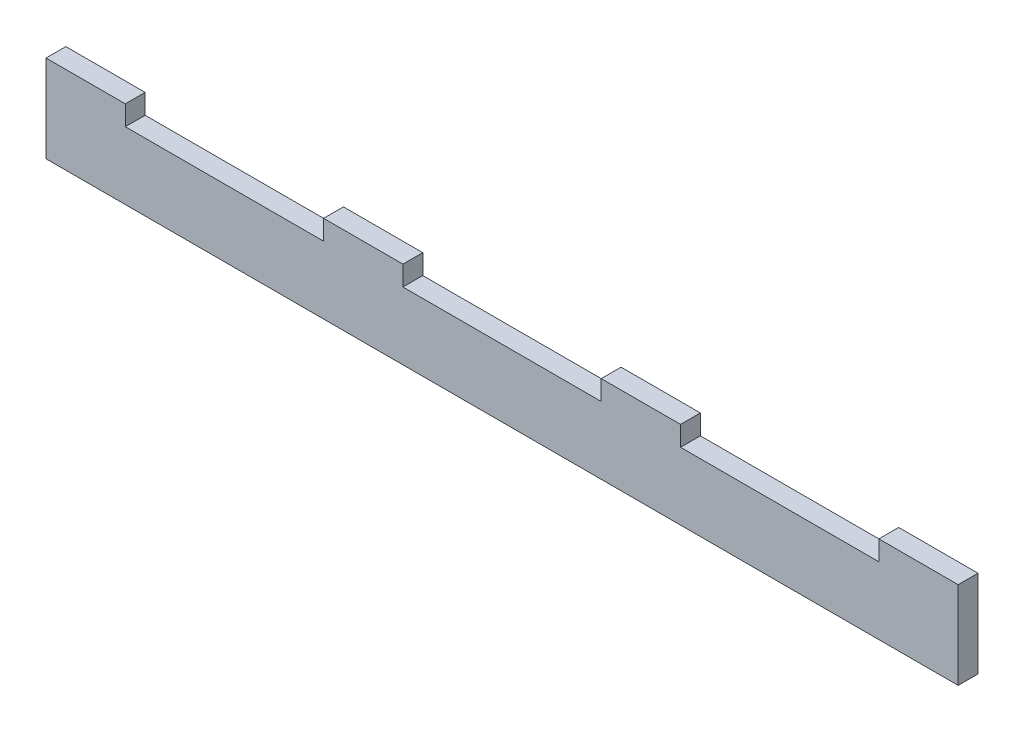
ISO-10303-21;
HEADER;
FILE_DESCRIPTION(('STEP AP214'),'2;1');
FILE_NAME('part.step','',(''),(''),'','','');
FILE_SCHEMA(('AUTOMOTIVE_DESIGN { 1 0 10303 214 1 1 1 1 }'));
ENDSEC;
DATA;
#1=APPLICATION_CONTEXT('core data for automotive mechanical design processes');
#2=APPLICATION_PROTOCOL_DEFINITION('international standard','automotive_design',2000,#1);
#3=PRODUCT_CONTEXT('',#1,'mechanical');
#4=PRODUCT('Part','Part','',(#3));
#5=PRODUCT_RELATED_PRODUCT_CATEGORY('part','',(#4));
#6=PRODUCT_DEFINITION_FORMATION('','',#4);
#7=PRODUCT_DEFINITION_CONTEXT('part definition',#1,'design');
#8=PRODUCT_DEFINITION('design','',#6,#7);
#9=PRODUCT_DEFINITION_SHAPE('','',#8);
#10=(LENGTH_UNIT() NAMED_UNIT(*) SI_UNIT(.MILLI.,.METRE.));
#11=(NAMED_UNIT(*) PLANE_ANGLE_UNIT() SI_UNIT($,.RADIAN.));
#12=(NAMED_UNIT(*) SI_UNIT($,.STERADIAN.) SOLID_ANGLE_UNIT());
#13=UNCERTAINTY_MEASURE_WITH_UNIT(LENGTH_MEASURE(1.E-05),#10,'distance_accuracy_value','');
#14=(GEOMETRIC_REPRESENTATION_CONTEXT(3) GLOBAL_UNCERTAINTY_ASSIGNED_CONTEXT((#13)) GLOBAL_UNIT_ASSIGNED_CONTEXT((#10,
#11,#12)) REPRESENTATION_CONTEXT('',''));
#15=CARTESIAN_POINT('',(0.,0.,0.));
#16=DIRECTION('',(0.,0.,1.));
#17=DIRECTION('',(1.,0.,0.));
#18=AXIS2_PLACEMENT_3D('',#15,#16,#17);
#19=CARTESIAN_POINT('',(20.,22.,5.));
#20=DIRECTION('',(0.,-1.,0.));
#21=DIRECTION('',(1.,0.,0.));
#22=AXIS2_PLACEMENT_3D('',#19,#20,#21);
#23=PLANE('',#22);
#24=DIRECTION('',(-1.,0.,0.));
#25=VECTOR('',#24,1.);
#26=CARTESIAN_POINT('',(20.,22.,0.));
#27=LINE('',#26,#25);
#28=CARTESIAN_POINT('',(20.,22.,0.));
#29=VERTEX_POINT('',#28);
#30=CARTESIAN_POINT('',(0.,22.,0.));
#31=VERTEX_POINT('',#30);
#32=EDGE_CURVE('E189',#29,#31,#27,.T.);
#33=ORIENTED_EDGE('',*,*,#32,.T.);
#34=DIRECTION('',(0.,0.,-1.));
#35=VECTOR('',#34,1.);
#36=CARTESIAN_POINT('',(0.,22.,5.));
#37=LINE('',#36,#35);
#38=CARTESIAN_POINT('',(0.,22.,5.));
#39=VERTEX_POINT('',#38);
#40=EDGE_CURVE('E11',#39,#31,#37,.T.);
#41=ORIENTED_EDGE('',*,*,#40,.F.);
#42=DIRECTION('',(-1.,0.,0.));
#43=VECTOR('',#42,1.);
#44=CARTESIAN_POINT('',(20.,22.,5.));
#45=LINE('',#44,#43);
#46=CARTESIAN_POINT('',(20.,22.,5.));
#47=VERTEX_POINT('',#46);
#48=EDGE_CURVE('E235',#47,#39,#45,.T.);
#49=ORIENTED_EDGE('',*,*,#48,.F.);
#50=DIRECTION('',(0.,0.,-1.));
#51=VECTOR('',#50,1.);
#52=CARTESIAN_POINT('',(20.,22.,5.));
#53=LINE('',#52,#51);
#54=EDGE_CURVE('E185',#47,#29,#53,.T.);
#55=ORIENTED_EDGE('',*,*,#54,.T.);
#56=EDGE_LOOP('',(#33,#41,#49,#55));
#57=FACE_BOUND('',#56,.T.);
#58=ADVANCED_FACE('F39',(#57),#23,.F.);
#59=CARTESIAN_POINT('',(0.,22.,5.));
#60=DIRECTION('',(1.,0.,0.));
#61=DIRECTION('',(0.,0.,-1.));
#62=AXIS2_PLACEMENT_3D('',#59,#60,#61);
#63=PLANE('',#62);
#64=DIRECTION('',(0.,-1.,0.));
#65=VECTOR('',#64,1.);
#66=CARTESIAN_POINT('',(0.,22.,0.));
#67=LINE('',#66,#65);
#68=CARTESIAN_POINT('',(0.,0.,0.));
#69=VERTEX_POINT('',#68);
#70=EDGE_CURVE('E193',#31,#69,#67,.T.);
#71=ORIENTED_EDGE('',*,*,#70,.T.);
#72=DIRECTION('',(0.,0.,-1.));
#73=VECTOR('',#72,1.);
#74=CARTESIAN_POINT('',(0.,0.,5.));
#75=LINE('',#74,#73);
#76=CARTESIAN_POINT('',(0.,0.,5.));
#77=VERTEX_POINT('',#76);
#78=EDGE_CURVE('E48',#77,#69,#75,.T.);
#79=ORIENTED_EDGE('',*,*,#78,.F.);
#80=DIRECTION('',(0.,-1.,0.));
#81=VECTOR('',#80,1.);
#82=CARTESIAN_POINT('',(0.,22.,5.));
#83=LINE('',#82,#81);
#84=EDGE_CURVE('E123',#39,#77,#83,.T.);
#85=ORIENTED_EDGE('',*,*,#84,.F.);
#86=ORIENTED_EDGE('',*,*,#40,.T.);
#87=EDGE_LOOP('',(#71,#79,#85,#86));
#88=FACE_BOUND('',#87,.T.);
#89=ADVANCED_FACE('F458',(#88),#63,.F.);
#90=CARTESIAN_POINT('',(0.,0.,5.));
#91=DIRECTION('',(0.,1.,0.));
#92=DIRECTION('',(0.,0.,1.));
#93=AXIS2_PLACEMENT_3D('',#90,#91,#92);
#94=PLANE('',#93);
#95=DIRECTION('',(1.,0.,0.));
#96=VECTOR('',#95,1.);
#97=CARTESIAN_POINT('',(0.,0.,0.));
#98=LINE('',#97,#96);
#99=CARTESIAN_POINT('',(230.,0.,0.));
#100=VERTEX_POINT('',#99);
#101=EDGE_CURVE('E196',#69,#100,#98,.T.);
#102=ORIENTED_EDGE('',*,*,#101,.T.);
#103=DIRECTION('',(0.,0.,-1.));
#104=VECTOR('',#103,1.);
#105=CARTESIAN_POINT('',(230.,0.,5.));
#106=LINE('',#105,#104);
#107=CARTESIAN_POINT('',(230.,0.,5.));
#108=VERTEX_POINT('',#107);
#109=EDGE_CURVE('E278',#108,#100,#106,.T.);
#110=ORIENTED_EDGE('',*,*,#109,.F.);
#111=DIRECTION('',(1.,0.,0.));
#112=VECTOR('',#111,1.);
#113=CARTESIAN_POINT('',(0.,0.,5.));
#114=LINE('',#113,#112);
#115=EDGE_CURVE('E289',#77,#108,#114,.T.);
#116=ORIENTED_EDGE('',*,*,#115,.F.);
#117=ORIENTED_EDGE('',*,*,#78,.T.);
#118=EDGE_LOOP('',(#102,#110,#116,#117));
#119=FACE_BOUND('',#118,.T.);
#120=ADVANCED_FACE('F287',(#119),#94,.F.);
#121=CARTESIAN_POINT('',(230.,0.,5.));
#122=DIRECTION('',(-1.,0.,0.));
#123=DIRECTION('',(0.,0.,1.));
#124=AXIS2_PLACEMENT_3D('',#121,#122,#123);
#125=PLANE('',#124);
#126=DIRECTION('',(0.,1.,0.));
#127=VECTOR('',#126,1.);
#128=CARTESIAN_POINT('',(230.,0.,0.));
#129=LINE('',#128,#127);
#130=CARTESIAN_POINT('',(230.,22.,0.));
#131=VERTEX_POINT('',#130);
#132=EDGE_CURVE('E199',#100,#131,#129,.T.);
#133=ORIENTED_EDGE('',*,*,#132,.T.);
#134=DIRECTION('',(0.,0.,-1.));
#135=VECTOR('',#134,1.);
#136=CARTESIAN_POINT('',(230.,22.,5.));
#137=LINE('',#136,#135);
#138=CARTESIAN_POINT('',(230.,22.,5.));
#139=VERTEX_POINT('',#138);
#140=EDGE_CURVE('E274',#139,#131,#137,.T.);
#141=ORIENTED_EDGE('',*,*,#140,.F.);
#142=DIRECTION('',(0.,1.,0.));
#143=VECTOR('',#142,1.);
#144=CARTESIAN_POINT('',(230.,0.,5.));
#145=LINE('',#144,#143);
#146=EDGE_CURVE('E308',#108,#139,#145,.T.);
#147=ORIENTED_EDGE('',*,*,#146,.F.);
#148=ORIENTED_EDGE('',*,*,#109,.T.);
#149=EDGE_LOOP('',(#133,#141,#147,#148));
#150=FACE_BOUND('',#149,.T.);
#151=ADVANCED_FACE('F298',(#150),#125,.F.);
#152=CARTESIAN_POINT('',(230.,22.,5.));
#153=DIRECTION('',(0.,-1.,0.));
#154=DIRECTION('',(1.,0.,0.));
#155=AXIS2_PLACEMENT_3D('',#152,#153,#154);
#156=PLANE('',#155);
#157=DIRECTION('',(-1.,0.,0.));
#158=VECTOR('',#157,1.);
#159=CARTESIAN_POINT('',(230.,22.,0.));
#160=LINE('',#159,#158);
#161=CARTESIAN_POINT('',(210.,22.,0.));
#162=VERTEX_POINT('',#161);
#163=EDGE_CURVE('E202',#131,#162,#160,.T.);
#164=ORIENTED_EDGE('',*,*,#163,.T.);
#165=DIRECTION('',(0.,0.,-1.));
#166=VECTOR('',#165,1.);
#167=CARTESIAN_POINT('',(210.,22.,5.));
#168=LINE('',#167,#166);
#169=CARTESIAN_POINT('',(210.,22.,5.));
#170=VERTEX_POINT('',#169);
#171=EDGE_CURVE('E270',#170,#162,#168,.T.);
#172=ORIENTED_EDGE('',*,*,#171,.F.);
#173=DIRECTION('',(-1.,0.,0.));
#174=VECTOR('',#173,1.);
#175=CARTESIAN_POINT('',(230.,22.,5.));
#176=LINE('',#175,#174);
#177=EDGE_CURVE('E304',#139,#170,#176,.T.);
#178=ORIENTED_EDGE('',*,*,#177,.F.);
#179=ORIENTED_EDGE('',*,*,#140,.T.);
#180=EDGE_LOOP('',(#164,#172,#178,#179));
#181=FACE_BOUND('',#180,.T.);
#182=ADVANCED_FACE('F302',(#181),#156,.F.);
#183=CARTESIAN_POINT('',(210.,22.,5.));
#184=DIRECTION('',(1.,0.,0.));
#185=DIRECTION('',(0.,0.,-1.));
#186=AXIS2_PLACEMENT_3D('',#183,#184,#185);
#187=PLANE('',#186);
#188=DIRECTION('',(0.,-1.,0.));
#189=VECTOR('',#188,1.);
#190=CARTESIAN_POINT('',(210.,22.,0.));
#191=LINE('',#190,#189);
#192=CARTESIAN_POINT('',(210.,17.,0.));
#193=VERTEX_POINT('',#192);
#194=EDGE_CURVE('E205',#162,#193,#191,.T.);
#195=ORIENTED_EDGE('',*,*,#194,.T.);
#196=DIRECTION('',(0.,0.,-1.));
#197=VECTOR('',#196,1.);
#198=CARTESIAN_POINT('',(210.,17.,5.));
#199=LINE('',#198,#197);
#200=CARTESIAN_POINT('',(210.,17.,5.));
#201=VERTEX_POINT('',#200);
#202=EDGE_CURVE('E266',#201,#193,#199,.T.);
#203=ORIENTED_EDGE('',*,*,#202,.F.);
#204=DIRECTION('',(0.,-1.,0.));
#205=VECTOR('',#204,1.);
#206=CARTESIAN_POINT('',(210.,22.,5.));
#207=LINE('',#206,#205);
#208=EDGE_CURVE('E307',#170,#201,#207,.T.);
#209=ORIENTED_EDGE('',*,*,#208,.F.);
#210=ORIENTED_EDGE('',*,*,#171,.T.);
#211=EDGE_LOOP('',(#195,#203,#209,#210));
#212=FACE_BOUND('',#211,.T.);
#213=ADVANCED_FACE('F552',(#212),#187,.F.);
#214=CARTESIAN_POINT('',(210.,17.,5.));
#215=DIRECTION('',(0.,-1.,0.));
#216=DIRECTION('',(1.,0.,0.));
#217=AXIS2_PLACEMENT_3D('',#214,#215,#216);
#218=PLANE('',#217);
#219=DIRECTION('',(-1.,0.,0.));
#220=VECTOR('',#219,1.);
#221=CARTESIAN_POINT('',(210.,17.,0.));
#222=LINE('',#221,#220);
#223=CARTESIAN_POINT('',(160.,17.,0.));
#224=VERTEX_POINT('',#223);
#225=EDGE_CURVE('E208',#193,#224,#222,.T.);
#226=ORIENTED_EDGE('',*,*,#225,.T.);
#227=DIRECTION('',(0.,0.,-1.));
#228=VECTOR('',#227,1.);
#229=CARTESIAN_POINT('',(160.,17.,5.));
#230=LINE('',#229,#228);
#231=CARTESIAN_POINT('',(160.,17.,5.));
#232=VERTEX_POINT('',#231);
#233=EDGE_CURVE('E262',#232,#224,#230,.T.);
#234=ORIENTED_EDGE('',*,*,#233,.F.);
#235=DIRECTION('',(-1.,0.,0.));
#236=VECTOR('',#235,1.);
#237=CARTESIAN_POINT('',(210.,17.,5.));
#238=LINE('',#237,#236);
#239=EDGE_CURVE('E313',#201,#232,#238,.T.);
#240=ORIENTED_EDGE('',*,*,#239,.F.);
#241=ORIENTED_EDGE('',*,*,#202,.T.);
#242=EDGE_LOOP('',(#226,#234,#240,#241));
#243=FACE_BOUND('',#242,.T.);
#244=ADVANCED_FACE('F542',(#243),#218,.F.);
#245=CARTESIAN_POINT('',(160.,17.,5.));
#246=DIRECTION('',(-1.,0.,0.));
#247=DIRECTION('',(0.,0.,1.));
#248=AXIS2_PLACEMENT_3D('',#245,#246,#247);
#249=PLANE('',#248);
#250=DIRECTION('',(0.,1.,0.));
#251=VECTOR('',#250,1.);
#252=CARTESIAN_POINT('',(160.,17.,0.));
#253=LINE('',#252,#251);
#254=CARTESIAN_POINT('',(160.,22.,0.));
#255=VERTEX_POINT('',#254);
#256=EDGE_CURVE('E211',#224,#255,#253,.T.);
#257=ORIENTED_EDGE('',*,*,#256,.T.);
#258=DIRECTION('',(0.,0.,-1.));
#259=VECTOR('',#258,1.);
#260=CARTESIAN_POINT('',(160.,22.,5.));
#261=LINE('',#260,#259);
#262=CARTESIAN_POINT('',(160.,22.,5.));
#263=VERTEX_POINT('',#262);
#264=EDGE_CURVE('E258',#263,#255,#261,.T.);
#265=ORIENTED_EDGE('',*,*,#264,.F.);
#266=DIRECTION('',(0.,1.,0.));
#267=VECTOR('',#266,1.);
#268=CARTESIAN_POINT('',(160.,17.,5.));
#269=LINE('',#268,#267);
#270=EDGE_CURVE('E320',#232,#263,#269,.T.);
#271=ORIENTED_EDGE('',*,*,#270,.F.);
#272=ORIENTED_EDGE('',*,*,#233,.T.);
#273=EDGE_LOOP('',(#257,#265,#271,#272));
#274=FACE_BOUND('',#273,.T.);
#275=ADVANCED_FACE('F532',(#274),#249,.F.);
#276=CARTESIAN_POINT('',(160.,22.,5.));
#277=DIRECTION('',(0.,-1.,0.));
#278=DIRECTION('',(1.,0.,0.));
#279=AXIS2_PLACEMENT_3D('',#276,#277,#278);
#280=PLANE('',#279);
#281=DIRECTION('',(-1.,0.,0.));
#282=VECTOR('',#281,1.);
#283=CARTESIAN_POINT('',(160.,22.,0.));
#284=LINE('',#283,#282);
#285=CARTESIAN_POINT('',(140.,22.,0.));
#286=VERTEX_POINT('',#285);
#287=EDGE_CURVE('E214',#255,#286,#284,.T.);
#288=ORIENTED_EDGE('',*,*,#287,.T.);
#289=DIRECTION('',(0.,0.,-1.));
#290=VECTOR('',#289,1.);
#291=CARTESIAN_POINT('',(140.,22.,5.));
#292=LINE('',#291,#290);
#293=CARTESIAN_POINT('',(140.,22.,5.));
#294=VERTEX_POINT('',#293);
#295=EDGE_CURVE('E254',#294,#286,#292,.T.);
#296=ORIENTED_EDGE('',*,*,#295,.F.);
#297=DIRECTION('',(-1.,0.,0.));
#298=VECTOR('',#297,1.);
#299=CARTESIAN_POINT('',(160.,22.,5.));
#300=LINE('',#299,#298);
#301=EDGE_CURVE('E323',#263,#294,#300,.T.);
#302=ORIENTED_EDGE('',*,*,#301,.F.);
#303=ORIENTED_EDGE('',*,*,#264,.T.);
#304=EDGE_LOOP('',(#288,#296,#302,#303));
#305=FACE_BOUND('',#304,.T.);
#306=ADVANCED_FACE('F522',(#305),#280,.F.);
#307=CARTESIAN_POINT('',(140.,22.,5.));
#308=DIRECTION('',(1.,0.,0.));
#309=DIRECTION('',(0.,0.,-1.));
#310=AXIS2_PLACEMENT_3D('',#307,#308,#309);
#311=PLANE('',#310);
#312=DIRECTION('',(0.,-1.,0.));
#313=VECTOR('',#312,1.);
#314=CARTESIAN_POINT('',(140.,22.,0.));
#315=LINE('',#314,#313);
#316=CARTESIAN_POINT('',(140.,17.,0.));
#317=VERTEX_POINT('',#316);
#318=EDGE_CURVE('E217',#286,#317,#315,.T.);
#319=ORIENTED_EDGE('',*,*,#318,.T.);
#320=DIRECTION('',(0.,0.,-1.));
#321=VECTOR('',#320,1.);
#322=CARTESIAN_POINT('',(140.,17.,5.));
#323=LINE('',#322,#321);
#324=CARTESIAN_POINT('',(140.,17.,5.));
#325=VERTEX_POINT('',#324);
#326=EDGE_CURVE('E250',#325,#317,#323,.T.);
#327=ORIENTED_EDGE('',*,*,#326,.F.);
#328=DIRECTION('',(0.,-1.,0.));
#329=VECTOR('',#328,1.);
#330=CARTESIAN_POINT('',(140.,22.,5.));
#331=LINE('',#330,#329);
#332=EDGE_CURVE('E326',#294,#325,#331,.T.);
#333=ORIENTED_EDGE('',*,*,#332,.F.);
#334=ORIENTED_EDGE('',*,*,#295,.T.);
#335=EDGE_LOOP('',(#319,#327,#333,#334));
#336=FACE_BOUND('',#335,.T.);
#337=ADVANCED_FACE('F512',(#336),#311,.F.);
#338=CARTESIAN_POINT('',(140.,17.,5.));
#339=DIRECTION('',(0.,-1.,0.));
#340=DIRECTION('',(1.,0.,0.));
#341=AXIS2_PLACEMENT_3D('',#338,#339,#340);
#342=PLANE('',#341);
#343=DIRECTION('',(-1.,0.,0.));
#344=VECTOR('',#343,1.);
#345=CARTESIAN_POINT('',(140.,17.,0.));
#346=LINE('',#345,#344);
#347=CARTESIAN_POINT('',(90.,17.,0.));
#348=VERTEX_POINT('',#347);
#349=EDGE_CURVE('E220',#317,#348,#346,.T.);
#350=ORIENTED_EDGE('',*,*,#349,.T.);
#351=DIRECTION('',(0.,0.,-1.));
#352=VECTOR('',#351,1.);
#353=CARTESIAN_POINT('',(90.,17.,5.));
#354=LINE('',#353,#352);
#355=CARTESIAN_POINT('',(90.,17.,5.));
#356=VERTEX_POINT('',#355);
#357=EDGE_CURVE('E246',#356,#348,#354,.T.);
#358=ORIENTED_EDGE('',*,*,#357,.F.);
#359=DIRECTION('',(-1.,0.,0.));
#360=VECTOR('',#359,1.);
#361=CARTESIAN_POINT('',(140.,17.,5.));
#362=LINE('',#361,#360);
#363=EDGE_CURVE('E329',#325,#356,#362,.T.);
#364=ORIENTED_EDGE('',*,*,#363,.F.);
#365=ORIENTED_EDGE('',*,*,#326,.T.);
#366=EDGE_LOOP('',(#350,#358,#364,#365));
#367=FACE_BOUND('',#366,.T.);
#368=ADVANCED_FACE('F502',(#367),#342,.F.);
#369=CARTESIAN_POINT('',(90.,17.,5.));
#370=DIRECTION('',(-1.,0.,0.));
#371=DIRECTION('',(0.,0.,1.));
#372=AXIS2_PLACEMENT_3D('',#369,#370,#371);
#373=PLANE('',#372);
#374=DIRECTION('',(0.,1.,0.));
#375=VECTOR('',#374,1.);
#376=CARTESIAN_POINT('',(90.,17.,0.));
#377=LINE('',#376,#375);
#378=CARTESIAN_POINT('',(90.,22.,0.));
#379=VERTEX_POINT('',#378);
#380=EDGE_CURVE('E223',#348,#379,#377,.T.);
#381=ORIENTED_EDGE('',*,*,#380,.T.);
#382=DIRECTION('',(0.,0.,-1.));
#383=VECTOR('',#382,1.);
#384=CARTESIAN_POINT('',(90.,22.,5.));
#385=LINE('',#384,#383);
#386=CARTESIAN_POINT('',(90.,22.,5.));
#387=VERTEX_POINT('',#386);
#388=EDGE_CURVE('E242',#387,#379,#385,.T.);
#389=ORIENTED_EDGE('',*,*,#388,.F.);
#390=DIRECTION('',(0.,1.,0.));
#391=VECTOR('',#390,1.);
#392=CARTESIAN_POINT('',(90.,17.,5.));
#393=LINE('',#392,#391);
#394=EDGE_CURVE('E332',#356,#387,#393,.T.);
#395=ORIENTED_EDGE('',*,*,#394,.F.);
#396=ORIENTED_EDGE('',*,*,#357,.T.);
#397=EDGE_LOOP('',(#381,#389,#395,#396));
#398=FACE_BOUND('',#397,.T.);
#399=ADVANCED_FACE('F492',(#398),#373,.F.);
#400=CARTESIAN_POINT('',(90.,22.,5.));
#401=DIRECTION('',(0.,-1.,0.));
#402=DIRECTION('',(1.,0.,0.));
#403=AXIS2_PLACEMENT_3D('',#400,#401,#402);
#404=PLANE('',#403);
#405=DIRECTION('',(-1.,0.,0.));
#406=VECTOR('',#405,1.);
#407=CARTESIAN_POINT('',(90.,22.,0.));
#408=LINE('',#407,#406);
#409=CARTESIAN_POINT('',(70.,22.,0.));
#410=VERTEX_POINT('',#409);
#411=EDGE_CURVE('E226',#379,#410,#408,.T.);
#412=ORIENTED_EDGE('',*,*,#411,.T.);
#413=DIRECTION('',(0.,0.,-1.));
#414=VECTOR('',#413,1.);
#415=CARTESIAN_POINT('',(70.,22.,5.));
#416=LINE('',#415,#414);
#417=CARTESIAN_POINT('',(70.,22.,5.));
#418=VERTEX_POINT('',#417);
#419=EDGE_CURVE('E177',#418,#410,#416,.T.);
#420=ORIENTED_EDGE('',*,*,#419,.F.);
#421=DIRECTION('',(-1.,0.,0.));
#422=VECTOR('',#421,1.);
#423=CARTESIAN_POINT('',(90.,22.,5.));
#424=LINE('',#423,#422);
#425=EDGE_CURVE('E166',#387,#418,#424,.T.);
#426=ORIENTED_EDGE('',*,*,#425,.F.);
#427=ORIENTED_EDGE('',*,*,#388,.T.);
#428=EDGE_LOOP('',(#412,#420,#426,#427));
#429=FACE_BOUND('',#428,.T.);
#430=ADVANCED_FACE('F483',(#429),#404,.F.);
#431=CARTESIAN_POINT('',(70.,22.,5.));
#432=DIRECTION('',(1.,0.,0.));
#433=DIRECTION('',(0.,0.,-1.));
#434=AXIS2_PLACEMENT_3D('',#431,#432,#433);
#435=PLANE('',#434);
#436=DIRECTION('',(0.,-1.,0.));
#437=VECTOR('',#436,1.);
#438=CARTESIAN_POINT('',(70.,22.,0.));
#439=LINE('',#438,#437);
#440=CARTESIAN_POINT('',(70.,17.,0.));
#441=VERTEX_POINT('',#440);
#442=EDGE_CURVE('E175',#410,#441,#439,.T.);
#443=ORIENTED_EDGE('',*,*,#442,.T.);
#444=DIRECTION('',(0.,0.,-1.));
#445=VECTOR('',#444,1.);
#446=CARTESIAN_POINT('',(70.,17.,5.));
#447=LINE('',#446,#445);
#448=CARTESIAN_POINT('',(70.,17.,5.));
#449=VERTEX_POINT('',#448);
#450=EDGE_CURVE('E172',#449,#441,#447,.T.);
#451=ORIENTED_EDGE('',*,*,#450,.F.);
#452=DIRECTION('',(0.,-1.,0.));
#453=VECTOR('',#452,1.);
#454=CARTESIAN_POINT('',(70.,22.,5.));
#455=LINE('',#454,#453);
#456=EDGE_CURVE('E160',#418,#449,#455,.T.);
#457=ORIENTED_EDGE('',*,*,#456,.F.);
#458=ORIENTED_EDGE('',*,*,#419,.T.);
#459=EDGE_LOOP('',(#443,#451,#457,#458));
#460=FACE_BOUND('',#459,.T.);
#461=ADVANCED_FACE('F173',(#460),#435,.F.);
#462=CARTESIAN_POINT('',(70.,17.,5.));
#463=DIRECTION('',(0.,-1.,0.));
#464=DIRECTION('',(1.,0.,0.));
#465=AXIS2_PLACEMENT_3D('',#462,#463,#464);
#466=PLANE('',#465);
#467=DIRECTION('',(-1.,0.,0.));
#468=VECTOR('',#467,1.);
#469=CARTESIAN_POINT('',(70.,17.,0.));
#470=LINE('',#469,#468);
#471=CARTESIAN_POINT('',(20.,17.,0.));
#472=VERTEX_POINT('',#471);
#473=EDGE_CURVE('E109',#441,#472,#470,.T.);
#474=ORIENTED_EDGE('',*,*,#473,.T.);
#475=DIRECTION('',(0.,0.,-1.));
#476=VECTOR('',#475,1.);
#477=CARTESIAN_POINT('',(20.,17.,5.));
#478=LINE('',#477,#476);
#479=CARTESIAN_POINT('',(20.,17.,5.));
#480=VERTEX_POINT('',#479);
#481=EDGE_CURVE('E178',#480,#472,#478,.T.);
#482=ORIENTED_EDGE('',*,*,#481,.F.);
#483=DIRECTION('',(-1.,0.,0.));
#484=VECTOR('',#483,1.);
#485=CARTESIAN_POINT('',(70.,17.,5.));
#486=LINE('',#485,#484);
#487=EDGE_CURVE('E164',#449,#480,#486,.T.);
#488=ORIENTED_EDGE('',*,*,#487,.F.);
#489=ORIENTED_EDGE('',*,*,#450,.T.);
#490=EDGE_LOOP('',(#474,#482,#488,#489));
#491=FACE_BOUND('',#490,.T.);
#492=ADVANCED_FACE('F180',(#491),#466,.F.);
#493=CARTESIAN_POINT('',(20.,17.,5.));
#494=DIRECTION('',(-1.,0.,0.));
#495=DIRECTION('',(0.,0.,1.));
#496=AXIS2_PLACEMENT_3D('',#493,#494,#495);
#497=PLANE('',#496);
#498=DIRECTION('',(0.,1.,0.));
#499=VECTOR('',#498,1.);
#500=CARTESIAN_POINT('',(20.,17.,0.));
#501=LINE('',#500,#499);
#502=EDGE_CURVE('E115',#472,#29,#501,.T.);
#503=ORIENTED_EDGE('',*,*,#502,.T.);
#504=ORIENTED_EDGE('',*,*,#54,.F.);
#505=DIRECTION('',(0.,1.,0.));
#506=VECTOR('',#505,1.);
#507=CARTESIAN_POINT('',(20.,17.,5.));
#508=LINE('',#507,#506);
#509=EDGE_CURVE('E56',#480,#47,#508,.T.);
#510=ORIENTED_EDGE('',*,*,#509,.F.);
#511=ORIENTED_EDGE('',*,*,#481,.T.);
#512=EDGE_LOOP('',(#503,#504,#510,#511));
#513=FACE_BOUND('',#512,.T.);
#514=ADVANCED_FACE('F447',(#513),#497,.F.);
#515=CARTESIAN_POINT('',(0.,0.,5.));
#516=DIRECTION('',(0.,0.,1.));
#517=DIRECTION('',(1.,0.,0.));
#518=AXIS2_PLACEMENT_3D('',#515,#516,#517);
#519=PLANE('',#518);
#520=ORIENTED_EDGE('',*,*,#48,.T.);
#521=ORIENTED_EDGE('',*,*,#84,.T.);
#522=ORIENTED_EDGE('',*,*,#115,.T.);
#523=ORIENTED_EDGE('',*,*,#146,.T.);
#524=ORIENTED_EDGE('',*,*,#177,.T.);
#525=ORIENTED_EDGE('',*,*,#208,.T.);
#526=ORIENTED_EDGE('',*,*,#239,.T.);
#527=ORIENTED_EDGE('',*,*,#270,.T.);
#528=ORIENTED_EDGE('',*,*,#301,.T.);
#529=ORIENTED_EDGE('',*,*,#332,.T.);
#530=ORIENTED_EDGE('',*,*,#363,.T.);
#531=ORIENTED_EDGE('',*,*,#394,.T.);
#532=ORIENTED_EDGE('',*,*,#425,.T.);
#533=ORIENTED_EDGE('',*,*,#456,.T.);
#534=ORIENTED_EDGE('',*,*,#487,.T.);
#535=ORIENTED_EDGE('',*,*,#509,.T.);
#536=EDGE_LOOP('',(#520,#521,#522,#523,#524,#525,#526,#527,#528,#529,#530,#531,#532,#533,#534,#535));
#537=FACE_BOUND('',#536,.T.);
#538=ADVANCED_FACE('F162',(#537),#519,.T.);
#539=CARTESIAN_POINT('',(0.,0.,0.));
#540=DIRECTION('',(0.,0.,1.));
#541=DIRECTION('',(1.,0.,0.));
#542=AXIS2_PLACEMENT_3D('',#539,#540,#541);
#543=PLANE('',#542);
#544=ORIENTED_EDGE('',*,*,#32,.F.);
#545=ORIENTED_EDGE('',*,*,#502,.F.);
#546=ORIENTED_EDGE('',*,*,#473,.F.);
#547=ORIENTED_EDGE('',*,*,#442,.F.);
#548=ORIENTED_EDGE('',*,*,#411,.F.);
#549=ORIENTED_EDGE('',*,*,#380,.F.);
#550=ORIENTED_EDGE('',*,*,#349,.F.);
#551=ORIENTED_EDGE('',*,*,#318,.F.);
#552=ORIENTED_EDGE('',*,*,#287,.F.);
#553=ORIENTED_EDGE('',*,*,#256,.F.);
#554=ORIENTED_EDGE('',*,*,#225,.F.);
#555=ORIENTED_EDGE('',*,*,#194,.F.);
#556=ORIENTED_EDGE('',*,*,#163,.F.);
#557=ORIENTED_EDGE('',*,*,#132,.F.);
#558=ORIENTED_EDGE('',*,*,#101,.F.);
#559=ORIENTED_EDGE('',*,*,#70,.F.);
#560=EDGE_LOOP('',(#544,#545,#546,#547,#548,#549,#550,#551,#552,#553,#554,#555,#556,#557,#558,#559));
#561=FACE_BOUND('',#560,.T.);
#562=ADVANCED_FACE('F293',(#561),#543,.F.);
#563=CLOSED_SHELL('',(#58,#89,#120,#151,#182,#213,#244,#275,#306,#337,#368,#399,#430,#461,#492,
#514,#538,#562));
#564=MANIFOLD_SOLID_BREP('B2',#563);
#565=ADVANCED_BREP_SHAPE_REPRESENTATION('',(#18,#564),#14);
#566=SHAPE_DEFINITION_REPRESENTATION(#9,#565);
ENDSEC;
END-ISO-10303-21;
